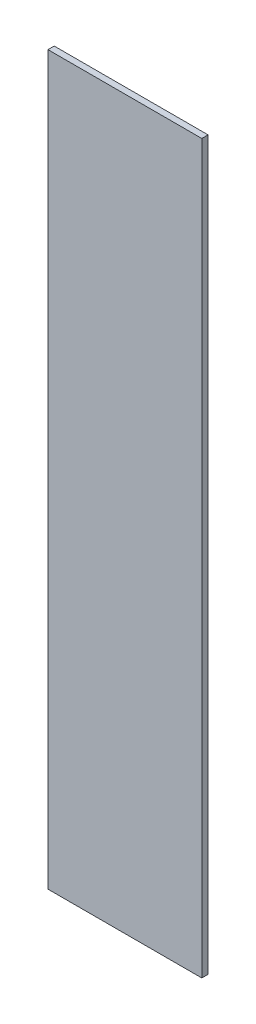
ISO-10303-21;
HEADER;
FILE_DESCRIPTION(('STEP AP214'),'2;1');
FILE_NAME('part.step','',(''),(''),'','','');
FILE_SCHEMA(('AUTOMOTIVE_DESIGN { 1 0 10303 214 1 1 1 1 }'));
ENDSEC;
DATA;
#1=APPLICATION_CONTEXT('core data for automotive mechanical design processes');
#2=APPLICATION_PROTOCOL_DEFINITION('international standard','automotive_design',2000,#1);
#3=PRODUCT_CONTEXT('',#1,'mechanical');
#4=PRODUCT('Part','Part','',(#3));
#5=PRODUCT_RELATED_PRODUCT_CATEGORY('part','',(#4));
#6=PRODUCT_DEFINITION_FORMATION('','',#4);
#7=PRODUCT_DEFINITION_CONTEXT('part definition',#1,'design');
#8=PRODUCT_DEFINITION('design','',#6,#7);
#9=PRODUCT_DEFINITION_SHAPE('','',#8);
#10=(LENGTH_UNIT() NAMED_UNIT(*) SI_UNIT(.MILLI.,.METRE.));
#11=(NAMED_UNIT(*) PLANE_ANGLE_UNIT() SI_UNIT($,.RADIAN.));
#12=(NAMED_UNIT(*) SI_UNIT($,.STERADIAN.) SOLID_ANGLE_UNIT());
#13=UNCERTAINTY_MEASURE_WITH_UNIT(LENGTH_MEASURE(1.E-05),#10,'distance_accuracy_value','');
#14=(GEOMETRIC_REPRESENTATION_CONTEXT(3) GLOBAL_UNCERTAINTY_ASSIGNED_CONTEXT((#13)) GLOBAL_UNIT_ASSIGNED_CONTEXT((#10,
#11,#12)) REPRESENTATION_CONTEXT('',''));
#15=CARTESIAN_POINT('',(0.,0.,0.));
#16=DIRECTION('',(0.,0.,1.));
#17=DIRECTION('',(1.,0.,0.));
#18=AXIS2_PLACEMENT_3D('',#15,#16,#17);
#19=CARTESIAN_POINT('',(38.1,180.,3.1));
#20=DIRECTION('',(-1.,0.,0.));
#21=DIRECTION('',(0.,-1.,0.));
#22=AXIS2_PLACEMENT_3D('',#19,#20,#21);
#23=PLANE('',#22);
#24=DIRECTION('',(0.,1.,0.));
#25=VECTOR('',#24,1.);
#26=CARTESIAN_POINT('',(38.1,180.,0.));
#27=LINE('',#26,#25);
#28=CARTESIAN_POINT('',(38.1,-180.,0.));
#29=VERTEX_POINT('',#28);
#30=CARTESIAN_POINT('',(38.1,180.,0.));
#31=VERTEX_POINT('',#30);
#32=EDGE_CURVE('E113',#29,#31,#27,.T.);
#33=ORIENTED_EDGE('',*,*,#32,.T.);
#34=DIRECTION('',(0.,0.,-1.));
#35=VECTOR('',#34,1.);
#36=CARTESIAN_POINT('',(38.1,180.,3.1));
#37=LINE('',#36,#35);
#38=CARTESIAN_POINT('',(38.1,180.,3.1));
#39=VERTEX_POINT('',#38);
#40=EDGE_CURVE('E11',#39,#31,#37,.T.);
#41=ORIENTED_EDGE('',*,*,#40,.F.);
#42=DIRECTION('',(0.,1.,0.));
#43=VECTOR('',#42,1.);
#44=CARTESIAN_POINT('',(38.1,180.,3.1));
#45=LINE('',#44,#43);
#46=CARTESIAN_POINT('',(38.1,-180.,3.1));
#47=VERTEX_POINT('',#46);
#48=EDGE_CURVE('E97',#47,#39,#45,.T.);
#49=ORIENTED_EDGE('',*,*,#48,.F.);
#50=DIRECTION('',(0.,0.,-1.));
#51=VECTOR('',#50,1.);
#52=CARTESIAN_POINT('',(38.1,-180.,3.1));
#53=LINE('',#52,#51);
#54=EDGE_CURVE('E109',#47,#29,#53,.T.);
#55=ORIENTED_EDGE('',*,*,#54,.T.);
#56=EDGE_LOOP('',(#33,#41,#49,#55));
#57=FACE_BOUND('',#56,.T.);
#58=ADVANCED_FACE('F45',(#57),#23,.F.);
#59=CARTESIAN_POINT('',(-38.1,180.,3.1));
#60=DIRECTION('',(0.,-1.,0.));
#61=DIRECTION('',(0.,0.,-1.));
#62=AXIS2_PLACEMENT_3D('',#59,#60,#61);
#63=PLANE('',#62);
#64=DIRECTION('',(-1.,0.,0.));
#65=VECTOR('',#64,1.);
#66=CARTESIAN_POINT('',(-38.1,180.,0.));
#67=LINE('',#66,#65);
#68=CARTESIAN_POINT('',(-38.1,180.,0.));
#69=VERTEX_POINT('',#68);
#70=EDGE_CURVE('E102',#31,#69,#67,.T.);
#71=ORIENTED_EDGE('',*,*,#70,.T.);
#72=DIRECTION('',(0.,0.,-1.));
#73=VECTOR('',#72,1.);
#74=CARTESIAN_POINT('',(-38.1,180.,3.1));
#75=LINE('',#74,#73);
#76=CARTESIAN_POINT('',(-38.1,180.,3.1));
#77=VERTEX_POINT('',#76);
#78=EDGE_CURVE('E54',#77,#69,#75,.T.);
#79=ORIENTED_EDGE('',*,*,#78,.F.);
#80=DIRECTION('',(-1.,0.,0.));
#81=VECTOR('',#80,1.);
#82=CARTESIAN_POINT('',(-38.1,180.,3.1));
#83=LINE('',#82,#81);
#84=EDGE_CURVE('E92',#39,#77,#83,.T.);
#85=ORIENTED_EDGE('',*,*,#84,.F.);
#86=ORIENTED_EDGE('',*,*,#40,.T.);
#87=EDGE_LOOP('',(#71,#79,#85,#86));
#88=FACE_BOUND('',#87,.T.);
#89=ADVANCED_FACE('F101',(#88),#63,.F.);
#90=CARTESIAN_POINT('',(-38.1,180.,3.1));
#91=DIRECTION('',(1.,0.,0.));
#92=DIRECTION('',(0.,1.,0.));
#93=AXIS2_PLACEMENT_3D('',#90,#91,#92);
#94=PLANE('',#93);
#95=DIRECTION('',(0.,-1.,0.));
#96=VECTOR('',#95,1.);
#97=CARTESIAN_POINT('',(-38.1,180.,0.));
#98=LINE('',#97,#96);
#99=CARTESIAN_POINT('',(-38.1,-180.,0.));
#100=VERTEX_POINT('',#99);
#101=EDGE_CURVE('E79',#69,#100,#98,.T.);
#102=ORIENTED_EDGE('',*,*,#101,.T.);
#103=DIRECTION('',(0.,0.,-1.));
#104=VECTOR('',#103,1.);
#105=CARTESIAN_POINT('',(-38.1,-180.,3.1));
#106=LINE('',#105,#104);
#107=CARTESIAN_POINT('',(-38.1,-180.,3.1));
#108=VERTEX_POINT('',#107);
#109=EDGE_CURVE('E104',#108,#100,#106,.T.);
#110=ORIENTED_EDGE('',*,*,#109,.F.);
#111=DIRECTION('',(0.,-1.,0.));
#112=VECTOR('',#111,1.);
#113=CARTESIAN_POINT('',(-38.1,180.,3.1));
#114=LINE('',#113,#112);
#115=EDGE_CURVE('E95',#77,#108,#114,.T.);
#116=ORIENTED_EDGE('',*,*,#115,.F.);
#117=ORIENTED_EDGE('',*,*,#78,.T.);
#118=EDGE_LOOP('',(#102,#110,#116,#117));
#119=FACE_BOUND('',#118,.T.);
#120=ADVANCED_FACE('F105',(#119),#94,.F.);
#121=CARTESIAN_POINT('',(-38.1,-180.,3.1));
#122=DIRECTION('',(0.,1.,0.));
#123=DIRECTION('',(0.,0.,1.));
#124=AXIS2_PLACEMENT_3D('',#121,#122,#123);
#125=PLANE('',#124);
#126=DIRECTION('',(1.,0.,0.));
#127=VECTOR('',#126,1.);
#128=CARTESIAN_POINT('',(-38.1,-180.,0.));
#129=LINE('',#128,#127);
#130=EDGE_CURVE('E85',#100,#29,#129,.T.);
#131=ORIENTED_EDGE('',*,*,#130,.T.);
#132=ORIENTED_EDGE('',*,*,#54,.F.);
#133=DIRECTION('',(1.,0.,0.));
#134=VECTOR('',#133,1.);
#135=CARTESIAN_POINT('',(-38.1,-180.,3.1));
#136=LINE('',#135,#134);
#137=EDGE_CURVE('E62',#108,#47,#136,.T.);
#138=ORIENTED_EDGE('',*,*,#137,.F.);
#139=ORIENTED_EDGE('',*,*,#109,.T.);
#140=EDGE_LOOP('',(#131,#132,#138,#139));
#141=FACE_BOUND('',#140,.T.);
#142=ADVANCED_FACE('F126',(#141),#125,.F.);
#143=CARTESIAN_POINT('',(0.,0.,3.1));
#144=DIRECTION('',(0.,0.,1.));
#145=DIRECTION('',(1.,0.,0.));
#146=AXIS2_PLACEMENT_3D('',#143,#144,#145);
#147=PLANE('',#146);
#148=ORIENTED_EDGE('',*,*,#48,.T.);
#149=ORIENTED_EDGE('',*,*,#84,.T.);
#150=ORIENTED_EDGE('',*,*,#115,.T.);
#151=ORIENTED_EDGE('',*,*,#137,.T.);
#152=EDGE_LOOP('',(#148,#149,#150,#151));
#153=FACE_BOUND('',#152,.T.);
#154=ADVANCED_FACE('F93',(#153),#147,.T.);
#155=CARTESIAN_POINT('',(0.,0.,0.));
#156=DIRECTION('',(0.,0.,1.));
#157=DIRECTION('',(1.,0.,0.));
#158=AXIS2_PLACEMENT_3D('',#155,#156,#157);
#159=PLANE('',#158);
#160=ORIENTED_EDGE('',*,*,#32,.F.);
#161=ORIENTED_EDGE('',*,*,#130,.F.);
#162=ORIENTED_EDGE('',*,*,#101,.F.);
#163=ORIENTED_EDGE('',*,*,#70,.F.);
#164=EDGE_LOOP('',(#160,#161,#162,#163));
#165=FACE_BOUND('',#164,.T.);
#166=ADVANCED_FACE('F129',(#165),#159,.F.);
#167=CLOSED_SHELL('',(#58,#89,#120,#142,#154,#166));
#168=MANIFOLD_SOLID_BREP('B2',#167);
#169=ADVANCED_BREP_SHAPE_REPRESENTATION('',(#18,#168),#14);
#170=SHAPE_DEFINITION_REPRESENTATION(#9,#169);
ENDSEC;
END-ISO-10303-21;
